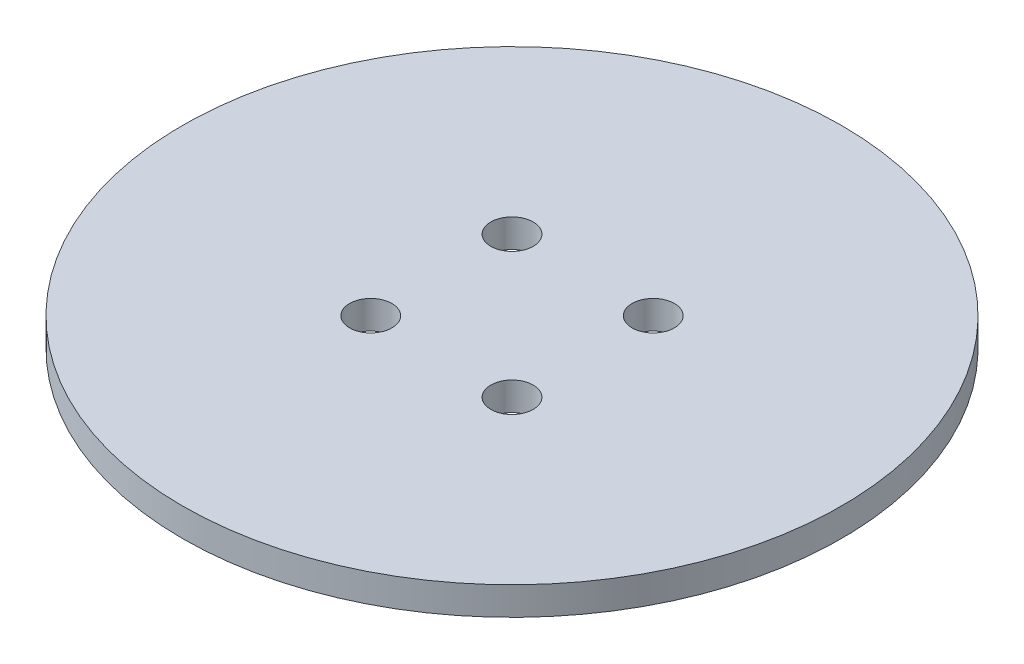
ISO-10303-21;
HEADER;
FILE_DESCRIPTION(('STEP AP214'),'2;1');
FILE_NAME('part.step','',(''),(''),'','','');
FILE_SCHEMA(('AUTOMOTIVE_DESIGN { 1 0 10303 214 1 1 1 1 }'));
ENDSEC;
DATA;
#1=APPLICATION_CONTEXT('core data for automotive mechanical design processes');
#2=APPLICATION_PROTOCOL_DEFINITION('international standard','automotive_design',2000,#1);
#3=PRODUCT_CONTEXT('',#1,'mechanical');
#4=PRODUCT('Part','Part','',(#3));
#5=PRODUCT_RELATED_PRODUCT_CATEGORY('part','',(#4));
#6=PRODUCT_DEFINITION_FORMATION('','',#4);
#7=PRODUCT_DEFINITION_CONTEXT('part definition',#1,'design');
#8=PRODUCT_DEFINITION('design','',#6,#7);
#9=PRODUCT_DEFINITION_SHAPE('','',#8);
#10=(LENGTH_UNIT() NAMED_UNIT(*) SI_UNIT(.MILLI.,.METRE.));
#11=(NAMED_UNIT(*) PLANE_ANGLE_UNIT() SI_UNIT($,.RADIAN.));
#12=(NAMED_UNIT(*) SI_UNIT($,.STERADIAN.) SOLID_ANGLE_UNIT());
#13=UNCERTAINTY_MEASURE_WITH_UNIT(LENGTH_MEASURE(1.E-05),#10,'distance_accuracy_value','');
#14=(GEOMETRIC_REPRESENTATION_CONTEXT(3) GLOBAL_UNCERTAINTY_ASSIGNED_CONTEXT((#13)) GLOBAL_UNIT_ASSIGNED_CONTEXT((#10,
#11,#12)) REPRESENTATION_CONTEXT('',''));
#15=CARTESIAN_POINT('',(0.,0.,0.));
#16=DIRECTION('',(0.,0.,1.));
#17=DIRECTION('',(1.,0.,0.));
#18=AXIS2_PLACEMENT_3D('',#15,#16,#17);
#19=CARTESIAN_POINT('',(0.,3.,0.));
#20=DIRECTION('',(0.,-1.,0.));
#21=DIRECTION('',(0.,0.,-1.));
#22=AXIS2_PLACEMENT_3D('',#19,#20,#21);
#23=CYLINDRICAL_SURFACE('',#22,35.);
#24=CARTESIAN_POINT('',(0.,3.,0.));
#25=DIRECTION('',(0.,1.,0.));
#26=DIRECTION('',(0.,0.,1.));
#27=AXIS2_PLACEMENT_3D('',#24,#25,#26);
#28=CIRCLE('',#27,35.);
#29=CARTESIAN_POINT('',(0.,3.,35.));
#30=VERTEX_POINT('',#29);
#31=EDGE_CURVE('E10',#30,#30,#28,.T.);
#32=ORIENTED_EDGE('',*,*,#31,.F.);
#33=EDGE_LOOP('',(#32));
#34=FACE_BOUND('',#33,.T.);
#35=CARTESIAN_POINT('',(0.,0.,0.));
#36=DIRECTION('',(0.,1.,0.));
#37=DIRECTION('',(0.,0.,1.));
#38=AXIS2_PLACEMENT_3D('',#35,#36,#37);
#39=CIRCLE('',#38,35.);
#40=CARTESIAN_POINT('',(0.,0.,35.));
#41=VERTEX_POINT('',#40);
#42=EDGE_CURVE('E34',#41,#41,#39,.T.);
#43=ORIENTED_EDGE('',*,*,#42,.T.);
#44=EDGE_LOOP('',(#43));
#45=FACE_BOUND('',#44,.T.);
#46=ADVANCED_FACE('F31',(#34,#45),#23,.T.);
#47=CARTESIAN_POINT('',(0.,3.,0.));
#48=DIRECTION('',(0.,1.,0.));
#49=DIRECTION('',(0.,0.,1.));
#50=AXIS2_PLACEMENT_3D('',#47,#48,#49);
#51=PLANE('',#50);
#52=CARTESIAN_POINT('',(-7.5,3.,-7.5));
#53=DIRECTION('',(0.,1.,0.));
#54=DIRECTION('',(0.,0.,1.));
#55=AXIS2_PLACEMENT_3D('',#52,#53,#54);
#56=CIRCLE('',#55,2.2479);
#57=CARTESIAN_POINT('',(-7.5,3.,-5.2521));
#58=VERTEX_POINT('',#57);
#59=EDGE_CURVE('E63',#58,#58,#56,.T.);
#60=ORIENTED_EDGE('',*,*,#59,.F.);
#61=EDGE_LOOP('',(#60));
#62=FACE_BOUND('',#61,.T.);
#63=CARTESIAN_POINT('',(7.5,3.,-7.5));
#64=DIRECTION('',(0.,1.,0.));
#65=DIRECTION('',(0.,0.,1.));
#66=AXIS2_PLACEMENT_3D('',#63,#64,#65);
#67=CIRCLE('',#66,2.2479);
#68=CARTESIAN_POINT('',(7.5,3.,-5.2521));
#69=VERTEX_POINT('',#68);
#70=EDGE_CURVE('E57',#69,#69,#67,.T.);
#71=ORIENTED_EDGE('',*,*,#70,.F.);
#72=EDGE_LOOP('',(#71));
#73=FACE_BOUND('',#72,.T.);
#74=CARTESIAN_POINT('',(-7.5,3.,7.5));
#75=DIRECTION('',(0.,1.,0.));
#76=DIRECTION('',(0.,0.,1.));
#77=AXIS2_PLACEMENT_3D('',#74,#75,#76);
#78=CIRCLE('',#77,2.2479);
#79=CARTESIAN_POINT('',(-7.5,3.,9.7479));
#80=VERTEX_POINT('',#79);
#81=EDGE_CURVE('E51',#80,#80,#78,.T.);
#82=ORIENTED_EDGE('',*,*,#81,.F.);
#83=EDGE_LOOP('',(#82));
#84=FACE_BOUND('',#83,.T.);
#85=CARTESIAN_POINT('',(7.5,3.,7.5));
#86=DIRECTION('',(0.,1.,0.));
#87=DIRECTION('',(0.,0.,1.));
#88=AXIS2_PLACEMENT_3D('',#85,#86,#87);
#89=CIRCLE('',#88,2.2479);
#90=CARTESIAN_POINT('',(7.5,3.,9.7479));
#91=VERTEX_POINT('',#90);
#92=EDGE_CURVE('E45',#91,#91,#89,.T.);
#93=ORIENTED_EDGE('',*,*,#92,.F.);
#94=EDGE_LOOP('',(#93));
#95=FACE_BOUND('',#94,.T.);
#96=ORIENTED_EDGE('',*,*,#31,.T.);
#97=EDGE_LOOP('',(#96));
#98=FACE_BOUND('',#97,.T.);
#99=ADVANCED_FACE('F69',(#62,#73,#84,#95,#98),#51,.T.);
#100=CARTESIAN_POINT('',(0.,0.,0.));
#101=DIRECTION('',(0.,1.,0.));
#102=DIRECTION('',(0.,0.,1.));
#103=AXIS2_PLACEMENT_3D('',#100,#101,#102);
#104=PLANE('',#103);
#105=CARTESIAN_POINT('',(-7.5,0.,-7.5));
#106=DIRECTION('',(0.,1.,0.));
#107=DIRECTION('',(0.,0.,1.));
#108=AXIS2_PLACEMENT_3D('',#105,#106,#107);
#109=CIRCLE('',#108,2.2479);
#110=CARTESIAN_POINT('',(-7.5,0.,-5.2521));
#111=VERTEX_POINT('',#110);
#112=EDGE_CURVE('E60',#111,#111,#109,.T.);
#113=ORIENTED_EDGE('',*,*,#112,.T.);
#114=EDGE_LOOP('',(#113));
#115=FACE_BOUND('',#114,.T.);
#116=CARTESIAN_POINT('',(7.5,0.,-7.5));
#117=DIRECTION('',(0.,1.,0.));
#118=DIRECTION('',(0.,0.,1.));
#119=AXIS2_PLACEMENT_3D('',#116,#117,#118);
#120=CIRCLE('',#119,2.2479);
#121=CARTESIAN_POINT('',(7.5,0.,-5.2521));
#122=VERTEX_POINT('',#121);
#123=EDGE_CURVE('E54',#122,#122,#120,.T.);
#124=ORIENTED_EDGE('',*,*,#123,.T.);
#125=EDGE_LOOP('',(#124));
#126=FACE_BOUND('',#125,.T.);
#127=CARTESIAN_POINT('',(-7.5,0.,7.5));
#128=DIRECTION('',(0.,1.,0.));
#129=DIRECTION('',(0.,0.,1.));
#130=AXIS2_PLACEMENT_3D('',#127,#128,#129);
#131=CIRCLE('',#130,2.2479);
#132=CARTESIAN_POINT('',(-7.5,0.,9.7479));
#133=VERTEX_POINT('',#132);
#134=EDGE_CURVE('E48',#133,#133,#131,.T.);
#135=ORIENTED_EDGE('',*,*,#134,.T.);
#136=EDGE_LOOP('',(#135));
#137=FACE_BOUND('',#136,.T.);
#138=CARTESIAN_POINT('',(7.5,0.,7.5));
#139=DIRECTION('',(0.,1.,0.));
#140=DIRECTION('',(0.,0.,1.));
#141=AXIS2_PLACEMENT_3D('',#138,#139,#140);
#142=CIRCLE('',#141,2.2479);
#143=CARTESIAN_POINT('',(7.5,0.,9.7479));
#144=VERTEX_POINT('',#143);
#145=EDGE_CURVE('E41',#144,#144,#142,.T.);
#146=ORIENTED_EDGE('',*,*,#145,.T.);
#147=EDGE_LOOP('',(#146));
#148=FACE_BOUND('',#147,.T.);
#149=ORIENTED_EDGE('',*,*,#42,.F.);
#150=EDGE_LOOP('',(#149));
#151=FACE_BOUND('',#150,.T.);
#152=ADVANCED_FACE('F72',(#115,#126,#137,#148,#151),#104,.F.);
#153=CARTESIAN_POINT('',(7.5,3.,7.5));
#154=DIRECTION('',(0.,1.,0.));
#155=DIRECTION('',(0.,0.,1.));
#156=AXIS2_PLACEMENT_3D('',#153,#154,#155);
#157=CYLINDRICAL_SURFACE('',#156,2.2479);
#158=ORIENTED_EDGE('',*,*,#145,.F.);
#159=EDGE_LOOP('',(#158));
#160=FACE_BOUND('',#159,.T.);
#161=ORIENTED_EDGE('',*,*,#92,.T.);
#162=EDGE_LOOP('',(#161));
#163=FACE_BOUND('',#162,.T.);
#164=ADVANCED_FACE('F80',(#160,#163),#157,.F.);
#165=CARTESIAN_POINT('',(-7.5,3.,7.5));
#166=DIRECTION('',(0.,1.,0.));
#167=DIRECTION('',(0.,0.,1.));
#168=AXIS2_PLACEMENT_3D('',#165,#166,#167);
#169=CYLINDRICAL_SURFACE('',#168,2.2479);
#170=ORIENTED_EDGE('',*,*,#134,.F.);
#171=EDGE_LOOP('',(#170));
#172=FACE_BOUND('',#171,.T.);
#173=ORIENTED_EDGE('',*,*,#81,.T.);
#174=EDGE_LOOP('',(#173));
#175=FACE_BOUND('',#174,.T.);
#176=ADVANCED_FACE('F82',(#172,#175),#169,.F.);
#177=CARTESIAN_POINT('',(7.5,3.,-7.5));
#178=DIRECTION('',(0.,1.,0.));
#179=DIRECTION('',(0.,0.,1.));
#180=AXIS2_PLACEMENT_3D('',#177,#178,#179);
#181=CYLINDRICAL_SURFACE('',#180,2.2479);
#182=ORIENTED_EDGE('',*,*,#123,.F.);
#183=EDGE_LOOP('',(#182));
#184=FACE_BOUND('',#183,.T.);
#185=ORIENTED_EDGE('',*,*,#70,.T.);
#186=EDGE_LOOP('',(#185));
#187=FACE_BOUND('',#186,.T.);
#188=ADVANCED_FACE('F89',(#184,#187),#181,.F.);
#189=CARTESIAN_POINT('',(-7.5,3.,-7.5));
#190=DIRECTION('',(0.,1.,0.));
#191=DIRECTION('',(0.,0.,1.));
#192=AXIS2_PLACEMENT_3D('',#189,#190,#191);
#193=CYLINDRICAL_SURFACE('',#192,2.2479);
#194=ORIENTED_EDGE('',*,*,#112,.F.);
#195=EDGE_LOOP('',(#194));
#196=FACE_BOUND('',#195,.T.);
#197=ORIENTED_EDGE('',*,*,#59,.T.);
#198=EDGE_LOOP('',(#197));
#199=FACE_BOUND('',#198,.T.);
#200=ADVANCED_FACE('F67',(#196,#199),#193,.F.);
#201=CLOSED_SHELL('',(#46,#99,#152,#164,#176,#188,#200));
#202=MANIFOLD_SOLID_BREP('B2',#201);
#203=ADVANCED_BREP_SHAPE_REPRESENTATION('',(#18,#202),#14);
#204=SHAPE_DEFINITION_REPRESENTATION(#9,#203);
ENDSEC;
END-ISO-10303-21;
